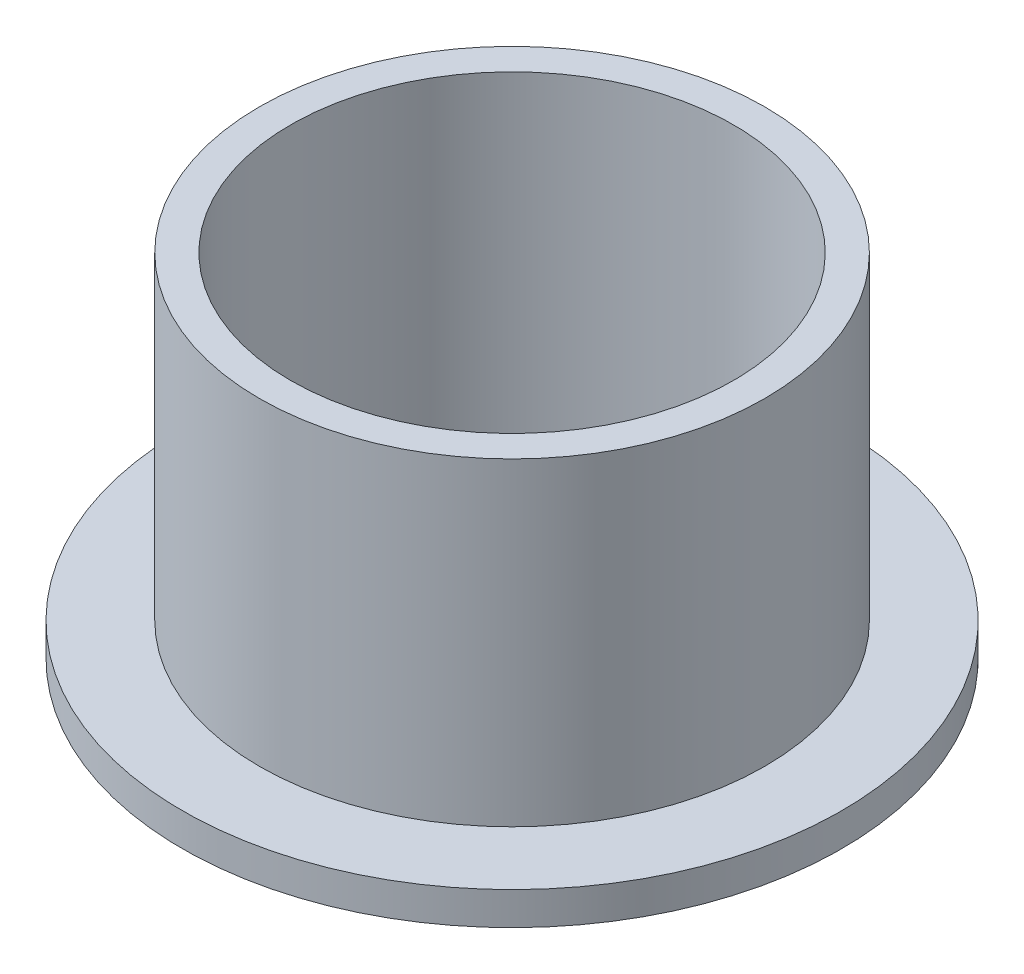
ISO-10303-21;
HEADER;
FILE_DESCRIPTION(('STEP AP214'),'2;1');
FILE_NAME('part.step','',(''),(''),'','','');
FILE_SCHEMA(('AUTOMOTIVE_DESIGN { 1 0 10303 214 1 1 1 1 }'));
ENDSEC;
DATA;
#1=APPLICATION_CONTEXT('core data for automotive mechanical design processes');
#2=APPLICATION_PROTOCOL_DEFINITION('international standard','automotive_design',2000,#1);
#3=PRODUCT_CONTEXT('',#1,'mechanical');
#4=PRODUCT('Part','Part','',(#3));
#5=PRODUCT_RELATED_PRODUCT_CATEGORY('part','',(#4));
#6=PRODUCT_DEFINITION_FORMATION('','',#4);
#7=PRODUCT_DEFINITION_CONTEXT('part definition',#1,'design');
#8=PRODUCT_DEFINITION('design','',#6,#7);
#9=PRODUCT_DEFINITION_SHAPE('','',#8);
#10=(LENGTH_UNIT() NAMED_UNIT(*) SI_UNIT(.MILLI.,.METRE.));
#11=(NAMED_UNIT(*) PLANE_ANGLE_UNIT() SI_UNIT($,.RADIAN.));
#12=(NAMED_UNIT(*) SI_UNIT($,.STERADIAN.) SOLID_ANGLE_UNIT());
#13=UNCERTAINTY_MEASURE_WITH_UNIT(LENGTH_MEASURE(1.E-05),#10,'distance_accuracy_value','');
#14=(GEOMETRIC_REPRESENTATION_CONTEXT(3) GLOBAL_UNCERTAINTY_ASSIGNED_CONTEXT((#13)) GLOBAL_UNIT_ASSIGNED_CONTEXT((#10,
#11,#12)) REPRESENTATION_CONTEXT('',''));
#15=CARTESIAN_POINT('',(0.,0.,0.));
#16=DIRECTION('',(0.,0.,1.));
#17=DIRECTION('',(1.,0.,0.));
#18=AXIS2_PLACEMENT_3D('',#15,#16,#17);
#19=CARTESIAN_POINT('',(0.,12.7,0.));
#20=DIRECTION('',(0.,1.,0.));
#21=DIRECTION('',(0.,0.,1.));
#22=AXIS2_PLACEMENT_3D('',#19,#20,#21);
#23=PLANE('',#22);
#24=CARTESIAN_POINT('',(0.,12.7,0.));
#25=DIRECTION('',(0.,1.,0.));
#26=DIRECTION('',(0.,0.,1.));
#27=AXIS2_PLACEMENT_3D('',#24,#25,#26);
#28=CIRCLE('',#27,9.128125);
#29=CARTESIAN_POINT('',(0.,12.7,9.128125));
#30=VERTEX_POINT('',#29);
#31=EDGE_CURVE('E10',#30,#30,#28,.T.);
#32=ORIENTED_EDGE('',*,*,#31,.T.);
#33=EDGE_LOOP('',(#32));
#34=FACE_BOUND('',#33,.T.);
#35=CARTESIAN_POINT('',(0.,12.7,0.));
#36=DIRECTION('',(0.,1.,0.));
#37=DIRECTION('',(0.,0.,1.));
#38=AXIS2_PLACEMENT_3D('',#35,#36,#37);
#39=CIRCLE('',#38,8.001);
#40=CARTESIAN_POINT('',(0.,12.7,8.001));
#41=VERTEX_POINT('',#40);
#42=EDGE_CURVE('E36',#41,#41,#39,.T.);
#43=ORIENTED_EDGE('',*,*,#42,.F.);
#44=EDGE_LOOP('',(#43));
#45=FACE_BOUND('',#44,.T.);
#46=ADVANCED_FACE('F29',(#34,#45),#23,.T.);
#47=CARTESIAN_POINT('',(0.,0.,0.));
#48=DIRECTION('',(0.,1.,0.));
#49=DIRECTION('',(0.,0.,1.));
#50=AXIS2_PLACEMENT_3D('',#47,#48,#49);
#51=PLANE('',#50);
#52=CARTESIAN_POINT('',(0.,0.,0.));
#53=DIRECTION('',(0.,1.,0.));
#54=DIRECTION('',(0.,0.,1.));
#55=AXIS2_PLACEMENT_3D('',#52,#53,#54);
#56=CIRCLE('',#55,8.001);
#57=CARTESIAN_POINT('',(0.,0.,8.001));
#58=VERTEX_POINT('',#57);
#59=EDGE_CURVE('E40',#58,#58,#56,.T.);
#60=ORIENTED_EDGE('',*,*,#59,.T.);
#61=EDGE_LOOP('',(#60));
#62=FACE_BOUND('',#61,.T.);
#63=CARTESIAN_POINT('',(0.,0.,0.));
#64=DIRECTION('',(0.,1.,0.));
#65=DIRECTION('',(0.,0.,1.));
#66=AXIS2_PLACEMENT_3D('',#63,#64,#65);
#67=CIRCLE('',#66,11.90625);
#68=CARTESIAN_POINT('',(0.,0.,-11.90625));
#69=VERTEX_POINT('',#68);
#70=EDGE_CURVE('E47',#69,#69,#67,.T.);
#71=ORIENTED_EDGE('',*,*,#70,.F.);
#72=EDGE_LOOP('',(#71));
#73=FACE_BOUND('',#72,.T.);
#74=ADVANCED_FACE('F72',(#62,#73),#51,.F.);
#75=CARTESIAN_POINT('',(0.,12.7,0.));
#76=DIRECTION('',(0.,-1.,0.));
#77=DIRECTION('',(0.,0.,-1.));
#78=AXIS2_PLACEMENT_3D('',#75,#76,#77);
#79=CYLINDRICAL_SURFACE('',#78,9.128125);
#80=CARTESIAN_POINT('',(0.,1.190625,0.));
#81=DIRECTION('',(0.,1.,0.));
#82=DIRECTION('',(0.,0.,1.));
#83=AXIS2_PLACEMENT_3D('',#80,#81,#82);
#84=CIRCLE('',#83,9.128125);
#85=CARTESIAN_POINT('',(0.,1.190625,9.128125));
#86=VERTEX_POINT('',#85);
#87=EDGE_CURVE('E50',#86,#86,#84,.T.);
#88=ORIENTED_EDGE('',*,*,#87,.T.);
#89=EDGE_LOOP('',(#88));
#90=FACE_BOUND('',#89,.T.);
#91=ORIENTED_EDGE('',*,*,#31,.F.);
#92=EDGE_LOOP('',(#91));
#93=FACE_BOUND('',#92,.T.);
#94=ADVANCED_FACE('F31',(#90,#93),#79,.T.);
#95=CARTESIAN_POINT('',(0.,12.7,0.));
#96=DIRECTION('',(0.,-1.,0.));
#97=DIRECTION('',(0.,0.,-1.));
#98=AXIS2_PLACEMENT_3D('',#95,#96,#97);
#99=CYLINDRICAL_SURFACE('',#98,8.001);
#100=ORIENTED_EDGE('',*,*,#42,.T.);
#101=EDGE_LOOP('',(#100));
#102=FACE_BOUND('',#101,.T.);
#103=ORIENTED_EDGE('',*,*,#59,.F.);
#104=EDGE_LOOP('',(#103));
#105=FACE_BOUND('',#104,.T.);
#106=ADVANCED_FACE('F61',(#102,#105),#99,.F.);
#107=CARTESIAN_POINT('',(0.,1.190625,0.));
#108=DIRECTION('',(0.,1.,0.));
#109=DIRECTION('',(0.,0.,1.));
#110=AXIS2_PLACEMENT_3D('',#107,#108,#109);
#111=PLANE('',#110);
#112=CARTESIAN_POINT('',(0.,1.190625,0.));
#113=DIRECTION('',(0.,1.,0.));
#114=DIRECTION('',(0.,0.,1.));
#115=AXIS2_PLACEMENT_3D('',#112,#113,#114);
#116=CIRCLE('',#115,11.90625);
#117=CARTESIAN_POINT('',(0.,1.190625,-11.90625));
#118=VERTEX_POINT('',#117);
#119=EDGE_CURVE('E45',#118,#118,#116,.T.);
#120=ORIENTED_EDGE('',*,*,#119,.T.);
#121=EDGE_LOOP('',(#120));
#122=FACE_BOUND('',#121,.T.);
#123=ORIENTED_EDGE('',*,*,#87,.F.);
#124=EDGE_LOOP('',(#123));
#125=FACE_BOUND('',#124,.T.);
#126=ADVANCED_FACE('F58',(#122,#125),#111,.T.);
#127=CARTESIAN_POINT('',(0.,1.190625,0.));
#128=DIRECTION('',(0.,-1.,0.));
#129=DIRECTION('',(0.,0.,-1.));
#130=AXIS2_PLACEMENT_3D('',#127,#128,#129);
#131=CYLINDRICAL_SURFACE('',#130,11.90625);
#132=CARTESIAN_POINT('',(0.,1.190625,-11.90625));
#133=CARTESIAN_POINT('',(0.,1.17822265625,-11.90625));
#134=CARTESIAN_POINT('',(0.,1.1658203125,-11.90625));
#135=CARTESIAN_POINT('',(0.,1.141015625,-11.90625));
#136=CARTESIAN_POINT('',(0.,1.12861328125,-11.90625));
#137=CARTESIAN_POINT('',(0.,1.10380859375,-11.90625));
#138=CARTESIAN_POINT('',(0.,1.09140625,-11.90625));
#139=CARTESIAN_POINT('',(0.,1.0666015625,-11.90625));
#140=CARTESIAN_POINT('',(0.,1.05419921875,-11.90625));
#141=CARTESIAN_POINT('',(0.,1.02939453125,-11.90625));
#142=CARTESIAN_POINT('',(0.,1.0169921875,-11.90625));
#143=CARTESIAN_POINT('',(0.,0.9921875,-11.90625));
#144=CARTESIAN_POINT('',(0.,0.97978515625,-11.90625));
#145=CARTESIAN_POINT('',(0.,0.95498046875,-11.90625));
#146=CARTESIAN_POINT('',(0.,0.942578125,-11.90625));
#147=CARTESIAN_POINT('',(0.,0.9177734375,-11.90625));
#148=CARTESIAN_POINT('',(0.,0.90537109375,-11.90625));
#149=CARTESIAN_POINT('',(0.,0.88056640625,-11.90625));
#150=CARTESIAN_POINT('',(0.,0.8681640625,-11.90625));
#151=CARTESIAN_POINT('',(0.,0.843359375,-11.90625));
#152=CARTESIAN_POINT('',(0.,0.83095703125,-11.90625));
#153=CARTESIAN_POINT('',(0.,0.80615234375,-11.90625));
#154=CARTESIAN_POINT('',(0.,0.79375,-11.90625));
#155=CARTESIAN_POINT('',(0.,0.7689453125,-11.90625));
#156=CARTESIAN_POINT('',(0.,0.75654296875,-11.90625));
#157=CARTESIAN_POINT('',(0.,0.73173828125,-11.90625));
#158=CARTESIAN_POINT('',(0.,0.7193359375,-11.90625));
#159=CARTESIAN_POINT('',(0.,0.69453125,-11.90625));
#160=CARTESIAN_POINT('',(0.,0.68212890625,-11.90625));
#161=CARTESIAN_POINT('',(0.,0.65732421875,-11.90625));
#162=CARTESIAN_POINT('',(0.,0.644921875,-11.90625));
#163=CARTESIAN_POINT('',(0.,0.6201171875,-11.90625));
#164=CARTESIAN_POINT('',(0.,0.60771484375,-11.90625));
#165=CARTESIAN_POINT('',(0.,0.58291015625,-11.90625));
#166=CARTESIAN_POINT('',(0.,0.5705078125,-11.90625));
#167=CARTESIAN_POINT('',(0.,0.545703125,-11.90625));
#168=CARTESIAN_POINT('',(0.,0.53330078125,-11.90625));
#169=CARTESIAN_POINT('',(0.,0.50849609375,-11.90625));
#170=CARTESIAN_POINT('',(0.,0.49609375,-11.90625));
#171=CARTESIAN_POINT('',(0.,0.4712890625,-11.90625));
#172=CARTESIAN_POINT('',(0.,0.45888671875,-11.90625));
#173=CARTESIAN_POINT('',(0.,0.43408203125,-11.90625));
#174=CARTESIAN_POINT('',(0.,0.4216796875,-11.90625));
#175=CARTESIAN_POINT('',(0.,0.396875,-11.90625));
#176=CARTESIAN_POINT('',(0.,0.38447265625,-11.90625));
#177=CARTESIAN_POINT('',(0.,0.35966796875,-11.90625));
#178=CARTESIAN_POINT('',(0.,0.347265625,-11.90625));
#179=CARTESIAN_POINT('',(0.,0.3224609375,-11.90625));
#180=CARTESIAN_POINT('',(0.,0.31005859375,-11.90625));
#181=CARTESIAN_POINT('',(0.,0.28525390625,-11.90625));
#182=CARTESIAN_POINT('',(0.,0.2728515625,-11.90625));
#183=CARTESIAN_POINT('',(0.,0.248046875,-11.90625));
#184=CARTESIAN_POINT('',(0.,0.23564453125,-11.90625));
#185=CARTESIAN_POINT('',(0.,0.21083984375,-11.90625));
#186=CARTESIAN_POINT('',(0.,0.1984375,-11.90625));
#187=CARTESIAN_POINT('',(0.,0.1736328125,-11.90625));
#188=CARTESIAN_POINT('',(0.,0.16123046875,-11.90625));
#189=CARTESIAN_POINT('',(0.,0.13642578125,-11.90625));
#190=CARTESIAN_POINT('',(0.,0.1240234375,-11.90625));
#191=CARTESIAN_POINT('',(0.,0.0992187500000001,-11.90625));
#192=CARTESIAN_POINT('',(0.,0.08681640625,-11.90625));
#193=CARTESIAN_POINT('',(0.,0.06201171875,-11.90625));
#194=CARTESIAN_POINT('',(0.,0.049609375,-11.90625));
#195=CARTESIAN_POINT('',(0.,0.0248046875,-11.90625));
#196=CARTESIAN_POINT('',(0.,0.01240234375,-11.90625));
#197=CARTESIAN_POINT('',(0.,0.,-11.90625));
#198=B_SPLINE_CURVE_WITH_KNOTS('',3,(#132,#133,#134,#135,#136,#137,#138,#139,#140,#141,#142,
#143,#144,#145,#146,#147,#148,#149,#150,#151,#152,#153,#154,#155,#156,#157,#158,#159,#160,#161,
#162,#163,#164,#165,#166,#167,#168,#169,#170,#171,#172,#173,#174,#175,#176,#177,#178,#179,#180,
#181,#182,#183,#184,#185,#186,#187,#188,#189,#190,#191,#192,#193,#194,#195,#196,#197),
.UNSPECIFIED.,.F.,.F.,(4,2,2,2,2,2,2,2,2,2,2,2,2,2,2,2,2,2,2,2,2,2,2,2,2,2,2,2,2,2,2,2,4),(0.,
0.03720703125,0.0744140625,0.11162109375,0.148828125,0.18603515625,0.2232421875,0.26044921875,
0.29765625,0.33486328125,0.3720703125,0.40927734375,0.446484375,0.48369140625,0.5208984375,
0.55810546875,0.5953125,0.63251953125,0.6697265625,0.70693359375,0.744140625,0.78134765625,
0.8185546875,0.85576171875,0.89296875,0.93017578125,0.9673828125,1.00458984375,1.041796875,
1.07900390625,1.1162109375,1.15341796875,1.190625),.UNSPECIFIED.);
#199=EDGE_CURVE('BSEAM60',#118,#69,#198,.T.);
#200=ORIENTED_EDGE('',*,*,#119,.F.);
#201=ORIENTED_EDGE('',*,*,#70,.T.);
#202=ORIENTED_EDGE('',*,*,#199,.T.);
#203=ORIENTED_EDGE('',*,*,#199,.F.);
#204=EDGE_LOOP('',(#200,#202,#201,#203));
#205=FACE_BOUND('',#204,.T.);
#206=ADVANCED_FACE('F60',(#205),#131,.T.);
#207=CLOSED_SHELL('',(#46,#74,#94,#106,#126,#206));
#208=MANIFOLD_SOLID_BREP('B2',#207);
#209=ADVANCED_BREP_SHAPE_REPRESENTATION('',(#18,#208),#14);
#210=SHAPE_DEFINITION_REPRESENTATION(#9,#209);
ENDSEC;
END-ISO-10303-21;
